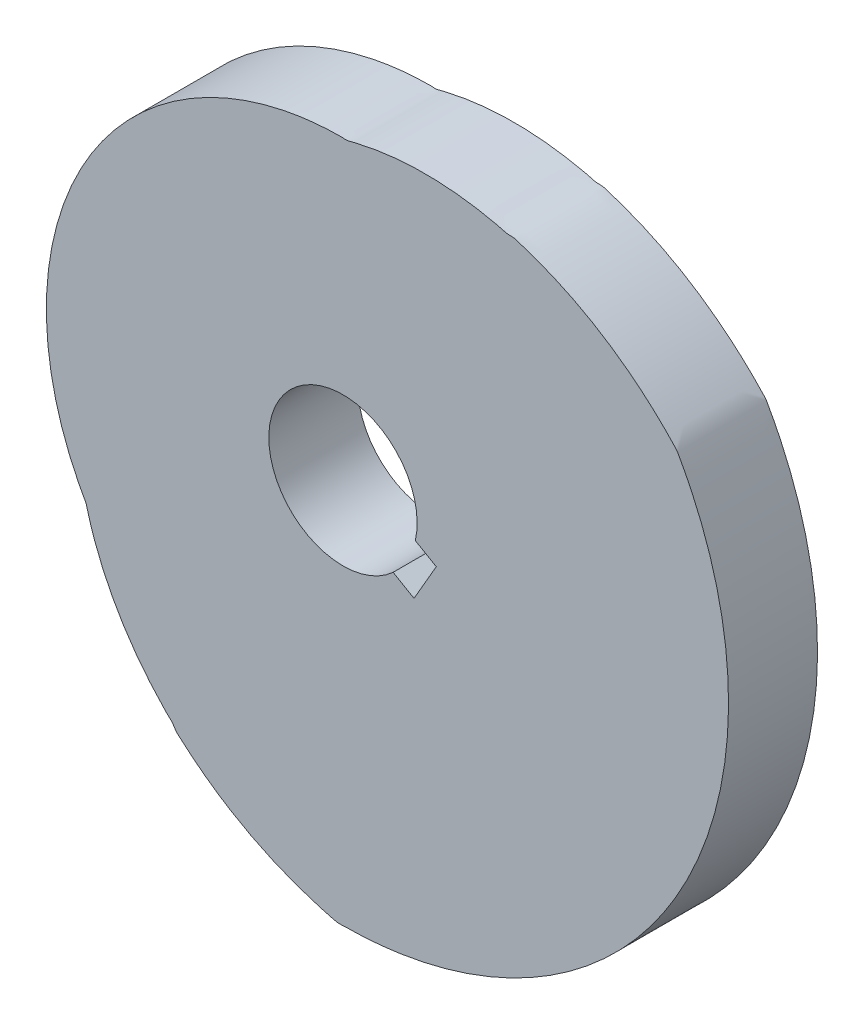
ISO-10303-21;
HEADER;
FILE_DESCRIPTION(('STEP AP214'),'2;1');
FILE_NAME('part.step','',(''),(''),'','','');
FILE_SCHEMA(('AUTOMOTIVE_DESIGN { 1 0 10303 214 1 1 1 1 }'));
ENDSEC;
DATA;
#1=APPLICATION_CONTEXT('core data for automotive mechanical design processes');
#2=APPLICATION_PROTOCOL_DEFINITION('international standard','automotive_design',2000,#1);
#3=PRODUCT_CONTEXT('',#1,'mechanical');
#4=PRODUCT('Part','Part','',(#3));
#5=PRODUCT_RELATED_PRODUCT_CATEGORY('part','',(#4));
#6=PRODUCT_DEFINITION_FORMATION('','',#4);
#7=PRODUCT_DEFINITION_CONTEXT('part definition',#1,'design');
#8=PRODUCT_DEFINITION('design','',#6,#7);
#9=PRODUCT_DEFINITION_SHAPE('','',#8);
#10=(LENGTH_UNIT() NAMED_UNIT(*) SI_UNIT(.MILLI.,.METRE.));
#11=(NAMED_UNIT(*) PLANE_ANGLE_UNIT() SI_UNIT($,.RADIAN.));
#12=(NAMED_UNIT(*) SI_UNIT($,.STERADIAN.) SOLID_ANGLE_UNIT());
#13=UNCERTAINTY_MEASURE_WITH_UNIT(LENGTH_MEASURE(1.E-05),#10,'distance_accuracy_value','');
#14=(GEOMETRIC_REPRESENTATION_CONTEXT(3) GLOBAL_UNCERTAINTY_ASSIGNED_CONTEXT((#13)) GLOBAL_UNIT_ASSIGNED_CONTEXT((#10,
#11,#12)) REPRESENTATION_CONTEXT('',''));
#15=CARTESIAN_POINT('',(0.,0.,0.));
#16=DIRECTION('',(0.,0.,1.));
#17=DIRECTION('',(1.,0.,0.));
#18=AXIS2_PLACEMENT_3D('',#15,#16,#17);
#19=CARTESIAN_POINT('',(-31.3220521803054,-28.7361578019046,12.));
#20=DIRECTION('',(0.,0.,1.));
#21=DIRECTION('',(1.,0.,0.));
#22=AXIS2_PLACEMENT_3D('',#19,#20,#21);
#23=PLANE('',#22);
#24=CARTESIAN_POINT('',(45.1375139420145,25.818691584479,12.));
#25=CARTESIAN_POINT('',(45.1146825222647,25.858606602012,12.));
#26=CARTESIAN_POINT('',(45.0689137924434,25.9383760677349,12.));
#27=CARTESIAN_POINT('',(44.9865616347543,26.051181125542,12.));
#28=CARTESIAN_POINT('',(44.9243310998781,26.1188960094875,12.));
#29=CARTESIAN_POINT('',(44.8931699539532,26.1527111737943,12.));
#30=CARTESIAN_POINT('',(44.5216769352879,26.5558445340137,12.));
#31=CARTESIAN_POINT('',(43.932009391613,27.1753236213259,12.));
#32=CARTESIAN_POINT('',(43.1104385471119,27.9956509431414,12.));
#33=CARTESIAN_POINT('',(42.4494659639389,28.6319249513327,12.));
#34=CARTESIAN_POINT('',(41.7794667058007,29.2536896581747,12.));
#35=CARTESIAN_POINT('',(41.1007453003057,29.8608246842116,12.));
#36=CARTESIAN_POINT('',(40.4136076813406,30.4532158450629,12.));
#37=CARTESIAN_POINT('',(39.7183611046927,31.0307551687494,12.));
#38=CARTESIAN_POINT('',(39.0153140142226,31.5933409054135,12.));
#39=CARTESIAN_POINT('',(38.3047759212348,32.1408775360101,12.));
#40=CARTESIAN_POINT('',(37.5870572804127,32.6732757782172,12.));
#41=CARTESIAN_POINT('',(36.8624693668106,33.190452590056,12.));
#42=CARTESIAN_POINT('',(36.1313241527549,33.6923311710322,12.));
#43=CARTESIAN_POINT('',(35.3939341850568,34.178840961101,12.));
#44=CARTESIAN_POINT('',(34.6506124623427,34.6499176364812,12.));
#45=CARTESIAN_POINT('',(33.9016723131523,35.1055031059402,12.));
#46=CARTESIAN_POINT('',(33.1474272726805,35.5455454941631,12.));
#47=CARTESIAN_POINT('',(32.3881909662416,35.9699991619211,12.));
#48=CARTESIAN_POINT('',(31.6242769696937,36.3788245786265,12.));
#49=CARTESIAN_POINT('',(30.8559987574643,36.7719887315482,12.));
#50=CARTESIAN_POINT('',(30.083669327889,37.1494635329817,12.));
#51=CARTESIAN_POINT('',(29.307602028269,37.5112316442159,12.));
#52=CARTESIAN_POINT('',(28.5281069317493,37.8572647725597,12.));
#53=CARTESIAN_POINT('',(27.7455037193961,38.1876040795103,12.));
#54=CARTESIAN_POINT('',(26.9600733343321,38.50206176566,12.));
#55=CARTESIAN_POINT('',(26.1722367779257,38.8013279743324,12.));
#56=CARTESIAN_POINT('',(25.3818912945507,39.0828644597575,12.));
#57=CARTESIAN_POINT('',(24.5908722728221,39.3561370240234,12.));
#58=CARTESIAN_POINT('',(23.793820402833,39.5861113830228,12.));
#59=CARTESIAN_POINT('',(22.9906355356767,39.9115269630809,12.));
#60=CARTESIAN_POINT('',(22.1216656693936,39.8140122974562,12.));
#61=CARTESIAN_POINT('',(21.3184028017399,40.1046608512462,12.));
#62=CARTESIAN_POINT('',(20.5213077995908,40.2712565739009,12.));
#63=CARTESIAN_POINT('',(19.7285046781832,40.4491337555346,12.));
#64=CARTESIAN_POINT('',(18.934815745728,40.6045148456853,12.));
#65=CARTESIAN_POINT('',(18.1419927236246,40.7464714026481,12.));
#66=CARTESIAN_POINT('',(17.3499395462985,40.8726722180211,12.));
#67=CARTESIAN_POINT('',(16.5590494027863,40.9838293214631,12.));
#68=CARTESIAN_POINT('',(15.7695823186814,41.0798513529012,12.));
#69=CARTESIAN_POINT('',(14.9818307548896,41.1608677106961,12.));
#70=CARTESIAN_POINT('',(14.1960753880527,41.2269557881758,12.));
#71=CARTESIAN_POINT('',(13.4125967582384,41.278213519306,12.));
#72=CARTESIAN_POINT('',(12.6316720437469,41.3147399833506,12.));
#73=CARTESIAN_POINT('',(11.853575797482,41.3366404863231,12.));
#74=CARTESIAN_POINT('',(11.0785796306525,41.3440251221162,12.));
#75=CARTESIAN_POINT('',(10.3069521779059,41.3370090727383,12.));
#76=CARTESIAN_POINT('',(9.53895899211167,41.3157124233372,12.));
#77=CARTESIAN_POINT('',(8.77486245005348,41.2802601786315,12.));
#78=CARTESIAN_POINT('',(8.01492169353169,41.230781947947,12.));
#79=CARTESIAN_POINT('',(7.25939242849471,41.1674127385473,12.));
#80=CARTESIAN_POINT('',(6.5085272630277,41.0902896626202,12.));
#81=CARTESIAN_POINT('',(5.76257405419242,40.9995637779329,12.));
#82=CARTESIAN_POINT('',(5.02178164458988,40.895355821003,12.));
#83=CARTESIAN_POINT('',(4.28637821303107,40.7779199243895,12.));
#84=CARTESIAN_POINT('',(3.55665115070893,40.6470363469999,12.));
#85=CARTESIAN_POINT('',(2.83265060948238,40.5042621033718,12.));
#86=CARTESIAN_POINT('',(2.11528799664478,40.3445881860127,12.));
#87=CARTESIAN_POINT('',(1.24782666705328,40.1533080354054,12.));
#88=CARTESIAN_POINT('',(0.631634374859922,39.9334378945776,12.));
#89=CARTESIAN_POINT('',(0.227217056019519,39.9642992261537,12.));
#90=CARTESIAN_POINT('',(0.176998450771492,39.9681314384641,12.));
#91=CARTESIAN_POINT('',(0.0769496216650999,39.9808853440723,12.));
#92=CARTESIAN_POINT('',(-0.0736132587577044,40.0000273863259,12.));
#93=CARTESIAN_POINT('',(-0.174341962512143,39.9996517669126,12.));
#94=CARTESIAN_POINT('',(-0.224705780026202,39.9993688364257,12.));
#95=CARTESIAN_POINT('',(-34.6069634558117,39.8062184879366,12.));
#96=CARTESIAN_POINT('',(-51.7854139904256,10.0223673741022,12.));
#97=CARTESIAN_POINT('',(-34.7355852354904,-19.8352998048423,12.));
#98=CARTESIAN_POINT('',(-34.7149304806663,-19.8714704200471,12.));
#99=CARTESIAN_POINT('',(-34.6735079762265,-19.9437471262647,12.));
#100=CARTESIAN_POINT('',(-34.6256423319763,-20.0616588265775,12.));
#101=CARTESIAN_POINT('',(-34.6052059445722,-20.1424183544329,12.));
#102=CARTESIAN_POINT('',(-34.5949226280262,-20.1827815270281,12.));
#103=CARTESIAN_POINT('',(-34.4903560652581,-20.5932170321298,12.));
#104=CARTESIAN_POINT('',(-34.3147089451669,-21.2382333641091,12.));
#105=CARTESIAN_POINT('',(-34.051889714492,-22.1140959330513,12.));
#106=CARTESIAN_POINT('',(-33.8265729604794,-22.8168594400827,12.));
#107=CARTESIAN_POINT('',(-33.5870484174464,-23.5184603864993,12.));
#108=CARTESIAN_POINT('',(-33.3332886427817,-24.2186160653096,12.));
#109=CARTESIAN_POINT('',(-33.0652717363569,-24.9170424421612,12.));
#110=CARTESIAN_POINT('',(-32.7829813944584,-25.6134542959464,12.));
#111=CARTESIAN_POINT('',(-32.4864069399912,-26.3075653189832,12.));
#112=CARTESIAN_POINT('',(-32.1755433564174,-26.9990882291884,12.));
#113=CARTESIAN_POINT('',(-31.8503913179985,-27.6877348800532,12.));
#114=CARTESIAN_POINT('',(-31.5109572183126,-28.3732163721897,12.));
#115=CARTESIAN_POINT('',(-31.1572531965328,-29.0552431654125,12.));
#116=CARTESIAN_POINT('',(-30.7892971614329,-29.7335251914549,12.));
#117=CARTESIAN_POINT('',(-30.4071128136735,-30.4077719677188,12.));
#118=CARTESIAN_POINT('',(-30.010729664087,-31.0776927101017,12.));
#119=CARTESIAN_POINT('',(-29.6001830564893,-31.7429964521127,12.));
#120=CARTESIAN_POINT('',(-29.1755141629144,-32.4033921429733,12.));
#121=CARTESIAN_POINT('',(-28.7367700718013,-33.0585888270609,12.));
#122=CARTESIAN_POINT('',(-28.2840035163402,-33.7082955200162,12.));
#123=CARTESIAN_POINT('',(-27.8172739436534,-34.3522222261925,12.));
#124=CARTESIAN_POINT('',(-27.3366435370521,-34.9900766710492,12.));
#125=CARTESIAN_POINT('',(-26.8421921830219,-35.6215771292271,12.));
#126=CARTESIAN_POINT('',(-26.3339612752131,-36.2464048022531,12.));
#127=CARTESIAN_POINT('',(-25.8121647729319,-36.8643832296415,12.));
#128=CARTESIAN_POINT('',(-25.2763965511123,-37.4748050572422,12.));
#129=CARTESIAN_POINT('',(-24.728607161581,-38.0789609018814,12.));
#130=CARTESIAN_POINT('',(-24.1619249230148,-38.670643052955,12.));
#131=CARTESIAN_POINT('',(-23.6026359714075,-39.2718074212572,12.));
#132=CARTESIAN_POINT('',(-22.9339019117336,-39.813761326399,12.));
#133=CARTESIAN_POINT('',(-22.5635942595921,-40.6129989424913,12.));
#134=CARTESIAN_POINT('',(-21.8649962663424,-41.1367752334924,12.));
#135=CARTESIAN_POINT('',(-21.2511595081493,-41.704835161853,12.));
#136=CARTESIAN_POINT('',(-20.603267988743,-42.2452201184356,12.));
#137=CARTESIAN_POINT('',(-19.94858417786,-42.7806873797805,12.));
#138=CARTESIAN_POINT('',(-19.2799443919699,-43.3047553718442,12.));
#139=CARTESIAN_POINT('',(-18.5994724785184,-43.8188271818331,12.));
#140=CARTESIAN_POINT('',(-17.9067959087357,-44.3221833459578,12.));
#141=CARTESIAN_POINT('',(-17.2022222434127,-44.8146795726867,12.));
#142=CARTESIAN_POINT('',(-16.4858828490174,-45.2960196987159,12.));
#143=CARTESIAN_POINT('',(-15.7579636621121,-45.7659518103205,12.));
#144=CARTESIAN_POINT('',(-15.0186429371753,-46.2242155249138,12.));
#145=CARTESIAN_POINT('',(-14.2681079723375,-46.6705563451511,12.));
#146=CARTESIAN_POINT('',(-13.5065505446389,-47.1047219333013,12.));
#147=CARTESIAN_POINT('',(-12.7341680810032,-47.5264632589804,12.));
#148=CARTESIAN_POINT('',(-11.9511632798901,-47.9355344280136,12.));
#149=CARTESIAN_POINT('',(-11.1577441496195,-48.3316928823991,12.));
#150=CARTESIAN_POINT('',(-10.3541239242068,-48.7146994367506,12.));
#151=CARTESIAN_POINT('',(-9.54052103695693,-49.084318592104,12.));
#152=CARTESIAN_POINT('',(-8.7171589721926,-49.4403178939774,12.));
#153=CARTESIAN_POINT('',(-7.88426653547609,-49.7824708491166,12.));
#154=CARTESIAN_POINT('',(-7.04207655034904,-50.1105464872198,12.));
#155=CARTESIAN_POINT('',(-6.19083044832525,-50.4243490405996,12.));
#156=CARTESIAN_POINT('',(-5.33076073085622,-50.7235695184947,12.));
#157=CARTESIAN_POINT('',(-4.46215646939338,-51.0083432516896,12.));
#158=CARTESIAN_POINT('',(-3.58511715243355,-51.2771579165623,12.));
#159=CARTESIAN_POINT('',(-2.7004761369747,-51.5347050394424,12.));
#160=CARTESIAN_POINT('',(-1.58532772918665,-51.8186985525633,12.));
#161=CARTESIAN_POINT('',(-0.769841320173459,-52.0746200739685,12.));
#162=CARTESIAN_POINT('',(-0.226209632260892,-52.0305720632972,12.));
#163=CARTESIAN_POINT('',(-0.176292161963245,-52.0265274770207,12.));
#164=CARTESIAN_POINT('',(-0.0767350828254432,-52.0150089942484,12.));
#165=CARTESIAN_POINT('',(0.0732065780635845,-52.000020818798,12.));
#166=CARTESIAN_POINT('',(0.173368394063963,-51.999735110022,12.));
#167=CARTESIAN_POINT('',(0.223448991171837,-51.9995199069024,12.));
#168=CARTESIAN_POINT('',(44.9867798212002,-51.8071658018382,12.));
#169=CARTESIAN_POINT('',(67.3633082390324,-13.0375415701507,12.));
#170=CARTESIAN_POINT('',(45.1375139420145,25.818691584479,12.));
#171=(BOUNDED_CURVE() B_SPLINE_CURVE(3,(#24,#25,#26,#27,#28,#29,#30,#31,#32,#33,#34,#35,#36,#37,
#38,#39,#40,#41,#42,#43,#44,#45,#46,#47,#48,#49,#50,#51,#52,#53,#54,#55,#56,#57,#58,#59,#60,#61,
#62,#63,#64,#65,#66,#67,#68,#69,#70,#71,#72,#73,#74,#75,#76,#77,#78,#79,#80,#81,#82,#83,#84,#85,
#86,#87,#88,#89,#90,#91,#92,#93,#94,#95,#96,#97,#98,#99,#100,#101,#102,#103,#104,#105,#106,#107,
#108,#109,#110,#111,#112,#113,#114,#115,#116,#117,#118,#119,#120,#121,#122,#123,#124,#125,#126,
#127,#128,#129,#130,#131,#132,#133,#134,#135,#136,#137,#138,#139,#140,#141,#142,#143,#144,#145,
#146,#147,#148,#149,#150,#151,#152,#153,#154,#155,#156,#157,#158,#159,#160,#161,#162,#163,#164,
#165,#166,#167,#168,#169,#170),.UNSPECIFIED.,.T.,.F.) B_SPLINE_CURVE_WITH_KNOTS((4,1,1,3,1,1,1,
1,1,1,1,1,1,1,1,1,1,1,1,1,1,1,1,1,1,1,1,1,1,1,1,1,1,1,1,1,1,1,1,1,1,1,1,1,1,1,1,1,1,1,1,1,1,1,1,
1,1,1,1,1,1,3,1,1,3,3,1,1,3,1,1,1,1,1,1,1,1,1,1,1,1,1,1,1,1,1,1,1,1,1,1,1,1,1,1,1,1,1,1,1,1,1,1,
1,1,1,1,1,1,1,1,1,1,1,1,1,1,1,1,1,1,1,1,1,1,1,3,1,1,3,4),(0.,0.000539854546905416,
0.00107970909381094,0.00161956364071636,0.00805553347807808,0.01165908907705,0.0152493116531498,
0.0188262036764522,0.0223897676447522,0.0259400060839757,0.0294769215485986,0.0330005166220726,
0.0365107939172595,0.0400077560768737,0.043491405773932,0.0469617457122131,0.0504187786267247,
0.0538625072841801,0.0572929344834824,0.0607100630562202,0.0641138958671706,0.0675044358148128,
0.0708816858318512,0.0742456488857486,0.07759632797927,0.0809337261510363,0.0842578464760895,
0.0875686920664674,0.0908662660717922,0.0941505716798675,0.0974216121172894,0.100679390650069,
0.103923910584265,0.107421904319601,0.110626668704688,0.113818188129065,0.116996466109011,
0.120161506204935,0.12331331202211,0.126451887211417,0.129577235470099,0.132689360542545,
0.135788266221073,0.138873956346742,0.141946434810177,0.145005705552405,0.148051772565722,
0.151084639894564,0.154104311636402,0.157110791942665,0.160104085019661,0.163084195129544,
0.166051126591277,0.169004883781637,0.171945471136222,0.174872893150498,0.177787154380855,
0.180688259445694,0.183576213026531,0.186451019869136,0.189312684784683,0.194020678935723,
0.194605295095236,0.195189911254749,0.195774527414262,0.463036609915361,0.463520098903989,
0.464003587892618,0.464487076881246,0.469403465621279,0.472245830199941,0.475101193155581,
0.477969559180411,0.480850932903117,0.483745318889981,0.486652721645973,0.489573145615829,
0.492506595185091,0.495453074681143,0.498412588374209,0.501385140478344,0.50437073515239,
0.507369376500923,0.510381068575177,0.513405815373947,0.516443620844472,0.519494488883309,
0.522558423337174,0.52563542800378,0.528725506632651,0.531828662925917,0.5349449005391,
0.53807422308188,0.541216634118844,0.544372137170222,0.547540735712613,0.550722433179683,
0.553917232962868,0.557399929571807,0.560634056239697,0.563881298380472,0.567141659184317,
0.57041514180306,0.573701749350781,0.577001484904397,0.580314351504248,0.583640352154666,
0.586979489824527,0.590331767447808,0.593697187924117,0.597075754119223,0.600467468865576,
0.603872334962808,0.607290355178237,0.610721532247355,0.614165868874304,0.61762336773235,
0.621094031464346,0.624577862683183,0.628074863972236,0.631585037885803,0.635108386949533,
0.638644913660845,0.642194620489348,0.64575750987724,0.649333584239715,0.655574566190206,
0.656147627029132,0.656720687868058,0.657293748706983,1.),
.UNSPECIFIED.) CURVE() GEOMETRIC_REPRESENTATION_ITEM() RATIONAL_B_SPLINE_CURVE((1.,1.,1.,1.,1.,
1.,1.,1.,1.,1.,1.,1.,1.,1.,1.,1.,1.,1.,1.,1.,1.,1.,1.,1.,1.,1.,1.,1.,1.,1.,1.,1.,1.,1.,1.,1.,1.,
1.,1.,1.,1.,1.,1.,1.,1.,1.,1.,1.,1.,1.,1.,1.,1.,1.,1.,1.,1.,1.,1.,1.,1.,1.,1.,1.,1.,1.,1.,1.,1.,
1.,1.,0.669654487287745,0.669654487287745,1.,1.,1.,1.,1.,1.,1.,1.,1.,1.,1.,1.,1.,1.,1.,1.,1.,1.,
1.,1.,1.,1.,1.,1.,1.,1.,1.,1.,1.,1.,1.,1.,1.,1.,1.,1.,1.,1.,1.,1.,1.,1.,1.,1.,1.,1.,1.,1.,1.,1.,
1.,1.,1.,1.,1.,1.,1.,1.,1.,1.,1.,1.,1.,1.,1.,1.,1.,1.,1.,1.,1.,0.669065133967935,
0.669065133967935,1.)) REPRESENTATION_ITEM(''));
#172=CARTESIAN_POINT('',(45.1375139420145,25.818691584479,12.));
#173=VERTEX_POINT('',#172);
#174=EDGE_CURVE('E119',#173,#173,#171,.T.);
#175=ORIENTED_EDGE('',*,*,#174,.T.);
#176=EDGE_LOOP('',(#175));
#177=FACE_BOUND('',#176,.T.);
#178=DIRECTION('',(0.866025403784439,-0.5,0.));
#179=VECTOR('',#178,1.);
#180=CARTESIAN_POINT('',(9.58512512714551,-8.99807618751146,12.));
#181=LINE('',#180,#179);
#182=CARTESIAN_POINT('',(6.76135582092916,-7.36777221843804,12.));
#183=VERTEX_POINT('',#182);
#184=CARTESIAN_POINT('',(9.58512512714551,-8.99807618751146,12.));
#185=VERTEX_POINT('',#184);
#186=EDGE_CURVE('E93',#183,#185,#181,.T.);
#187=ORIENTED_EDGE('',*,*,#186,.F.);
#188=CARTESIAN_POINT('',(0.,0.,12.));
#189=DIRECTION('',(0.,0.,1.));
#190=DIRECTION('',(1.,0.,0.));
#191=AXIS2_PLACEMENT_3D('',#188,#189,#190);
#192=CIRCLE('',#191,10.);
#193=CARTESIAN_POINT('',(9.76135582092916,-2.17161979573141,12.));
#194=VERTEX_POINT('',#193);
#195=EDGE_CURVE('E84',#194,#183,#192,.T.);
#196=ORIENTED_EDGE('',*,*,#195,.F.);
#197=DIRECTION('',(-0.866025403784439,0.5,0.));
#198=VECTOR('',#197,1.);
#199=CARTESIAN_POINT('',(9.76135582092916,-2.17161979573141,12.));
#200=LINE('',#199,#198);
#201=CARTESIAN_POINT('',(12.5851251271455,-3.80192376480482,12.));
#202=VERTEX_POINT('',#201);
#203=EDGE_CURVE('E109',#202,#194,#200,.T.);
#204=ORIENTED_EDGE('',*,*,#203,.F.);
#205=DIRECTION('',(0.5,0.866025403784439,0.));
#206=VECTOR('',#205,1.);
#207=CARTESIAN_POINT('',(12.5851251271455,-3.80192376480482,12.));
#208=LINE('',#207,#206);
#209=EDGE_CURVE('E105',#185,#202,#208,.T.);
#210=ORIENTED_EDGE('',*,*,#209,.F.);
#211=EDGE_LOOP('',(#187,#196,#204,#210));
#212=FACE_BOUND('',#211,.T.);
#213=ADVANCED_FACE('F43',(#177,#212),#23,.T.);
#214=CARTESIAN_POINT('',(-31.3220521803054,-28.7361578019046,0.));
#215=DIRECTION('',(0.,0.,1.));
#216=DIRECTION('',(1.,0.,0.));
#217=AXIS2_PLACEMENT_3D('',#214,#215,#216);
#218=PLANE('',#217);
#219=CARTESIAN_POINT('',(45.1375139420145,25.818691584479,0.));
#220=CARTESIAN_POINT('',(45.1146825222647,25.858606602012,0.));
#221=CARTESIAN_POINT('',(45.0689137924434,25.9383760677349,0.));
#222=CARTESIAN_POINT('',(44.9865616347543,26.051181125542,0.));
#223=CARTESIAN_POINT('',(44.9243310998781,26.1188960094875,0.));
#224=CARTESIAN_POINT('',(44.8931699539532,26.1527111737943,0.));
#225=CARTESIAN_POINT('',(44.5216769352879,26.5558445340137,0.));
#226=CARTESIAN_POINT('',(43.932009391613,27.1753236213259,0.));
#227=CARTESIAN_POINT('',(43.1104385471119,27.9956509431414,0.));
#228=CARTESIAN_POINT('',(42.4494659639389,28.6319249513327,0.));
#229=CARTESIAN_POINT('',(41.7794667058007,29.2536896581747,0.));
#230=CARTESIAN_POINT('',(41.1007453003057,29.8608246842116,0.));
#231=CARTESIAN_POINT('',(40.4136076813406,30.4532158450629,0.));
#232=CARTESIAN_POINT('',(39.7183611046927,31.0307551687494,0.));
#233=CARTESIAN_POINT('',(39.0153140142226,31.5933409054135,0.));
#234=CARTESIAN_POINT('',(38.3047759212348,32.1408775360101,0.));
#235=CARTESIAN_POINT('',(37.5870572804127,32.6732757782172,0.));
#236=CARTESIAN_POINT('',(36.8624693668106,33.190452590056,0.));
#237=CARTESIAN_POINT('',(36.1313241527549,33.6923311710322,0.));
#238=CARTESIAN_POINT('',(35.3939341850568,34.178840961101,0.));
#239=CARTESIAN_POINT('',(34.6506124623427,34.6499176364812,0.));
#240=CARTESIAN_POINT('',(33.9016723131523,35.1055031059402,0.));
#241=CARTESIAN_POINT('',(33.1474272726805,35.5455454941631,0.));
#242=CARTESIAN_POINT('',(32.3881909662416,35.9699991619211,0.));
#243=CARTESIAN_POINT('',(31.6242769696937,36.3788245786265,0.));
#244=CARTESIAN_POINT('',(30.8559987574643,36.7719887315482,0.));
#245=CARTESIAN_POINT('',(30.083669327889,37.1494635329817,0.));
#246=CARTESIAN_POINT('',(29.307602028269,37.5112316442159,0.));
#247=CARTESIAN_POINT('',(28.5281069317493,37.8572647725597,0.));
#248=CARTESIAN_POINT('',(27.7455037193961,38.1876040795103,0.));
#249=CARTESIAN_POINT('',(26.9600733343321,38.50206176566,0.));
#250=CARTESIAN_POINT('',(26.1722367779257,38.8013279743324,0.));
#251=CARTESIAN_POINT('',(25.3818912945507,39.0828644597575,0.));
#252=CARTESIAN_POINT('',(24.5908722728221,39.3561370240234,0.));
#253=CARTESIAN_POINT('',(23.793820402833,39.5861113830228,0.));
#254=CARTESIAN_POINT('',(22.9906355356767,39.9115269630809,0.));
#255=CARTESIAN_POINT('',(22.1216656693936,39.8140122974562,0.));
#256=CARTESIAN_POINT('',(21.3184028017399,40.1046608512462,0.));
#257=CARTESIAN_POINT('',(20.5213077995908,40.2712565739009,0.));
#258=CARTESIAN_POINT('',(19.7285046781832,40.4491337555346,0.));
#259=CARTESIAN_POINT('',(18.934815745728,40.6045148456853,0.));
#260=CARTESIAN_POINT('',(18.1419927236246,40.7464714026481,0.));
#261=CARTESIAN_POINT('',(17.3499395462985,40.8726722180211,0.));
#262=CARTESIAN_POINT('',(16.5590494027863,40.9838293214631,0.));
#263=CARTESIAN_POINT('',(15.7695823186814,41.0798513529012,0.));
#264=CARTESIAN_POINT('',(14.9818307548896,41.1608677106961,0.));
#265=CARTESIAN_POINT('',(14.1960753880527,41.2269557881758,0.));
#266=CARTESIAN_POINT('',(13.4125967582384,41.278213519306,0.));
#267=CARTESIAN_POINT('',(12.6316720437469,41.3147399833506,0.));
#268=CARTESIAN_POINT('',(11.853575797482,41.3366404863231,0.));
#269=CARTESIAN_POINT('',(11.0785796306525,41.3440251221162,0.));
#270=CARTESIAN_POINT('',(10.3069521779059,41.3370090727383,0.));
#271=CARTESIAN_POINT('',(9.53895899211167,41.3157124233372,0.));
#272=CARTESIAN_POINT('',(8.77486245005348,41.2802601786315,0.));
#273=CARTESIAN_POINT('',(8.01492169353169,41.230781947947,0.));
#274=CARTESIAN_POINT('',(7.25939242849471,41.1674127385473,0.));
#275=CARTESIAN_POINT('',(6.5085272630277,41.0902896626202,0.));
#276=CARTESIAN_POINT('',(5.76257405419242,40.9995637779329,0.));
#277=CARTESIAN_POINT('',(5.02178164458988,40.895355821003,0.));
#278=CARTESIAN_POINT('',(4.28637821303107,40.7779199243895,0.));
#279=CARTESIAN_POINT('',(3.55665115070893,40.6470363469999,0.));
#280=CARTESIAN_POINT('',(2.83265060948238,40.5042621033718,0.));
#281=CARTESIAN_POINT('',(2.11528799664478,40.3445881860127,0.));
#282=CARTESIAN_POINT('',(1.24782666705328,40.1533080354054,0.));
#283=CARTESIAN_POINT('',(0.631634374859922,39.9334378945776,0.));
#284=CARTESIAN_POINT('',(0.227217056019519,39.9642992261537,0.));
#285=CARTESIAN_POINT('',(0.176998450771492,39.9681314384641,0.));
#286=CARTESIAN_POINT('',(0.0769496216650999,39.9808853440723,0.));
#287=CARTESIAN_POINT('',(-0.0736132587577044,40.0000273863259,0.));
#288=CARTESIAN_POINT('',(-0.174341962512143,39.9996517669126,0.));
#289=CARTESIAN_POINT('',(-0.224705780026202,39.9993688364257,0.));
#290=CARTESIAN_POINT('',(-34.6069634558117,39.8062184879366,0.));
#291=CARTESIAN_POINT('',(-51.7854139904256,10.0223673741022,0.));
#292=CARTESIAN_POINT('',(-34.7355852354904,-19.8352998048423,0.));
#293=CARTESIAN_POINT('',(-34.7149304806663,-19.8714704200471,0.));
#294=CARTESIAN_POINT('',(-34.6735079762265,-19.9437471262647,0.));
#295=CARTESIAN_POINT('',(-34.6256423319763,-20.0616588265775,0.));
#296=CARTESIAN_POINT('',(-34.6052059445722,-20.1424183544329,0.));
#297=CARTESIAN_POINT('',(-34.5949226280262,-20.1827815270281,0.));
#298=CARTESIAN_POINT('',(-34.4903560652581,-20.5932170321298,0.));
#299=CARTESIAN_POINT('',(-34.3147089451669,-21.2382333641091,0.));
#300=CARTESIAN_POINT('',(-34.051889714492,-22.1140959330513,0.));
#301=CARTESIAN_POINT('',(-33.8265729604794,-22.8168594400827,0.));
#302=CARTESIAN_POINT('',(-33.5870484174464,-23.5184603864993,0.));
#303=CARTESIAN_POINT('',(-33.3332886427817,-24.2186160653096,0.));
#304=CARTESIAN_POINT('',(-33.0652717363569,-24.9170424421612,0.));
#305=CARTESIAN_POINT('',(-32.7829813944584,-25.6134542959464,0.));
#306=CARTESIAN_POINT('',(-32.4864069399912,-26.3075653189832,0.));
#307=CARTESIAN_POINT('',(-32.1755433564174,-26.9990882291884,0.));
#308=CARTESIAN_POINT('',(-31.8503913179985,-27.6877348800532,0.));
#309=CARTESIAN_POINT('',(-31.5109572183126,-28.3732163721897,0.));
#310=CARTESIAN_POINT('',(-31.1572531965328,-29.0552431654125,0.));
#311=CARTESIAN_POINT('',(-30.7892971614329,-29.7335251914549,0.));
#312=CARTESIAN_POINT('',(-30.4071128136735,-30.4077719677188,0.));
#313=CARTESIAN_POINT('',(-30.010729664087,-31.0776927101017,0.));
#314=CARTESIAN_POINT('',(-29.6001830564893,-31.7429964521127,0.));
#315=CARTESIAN_POINT('',(-29.1755141629144,-32.4033921429733,0.));
#316=CARTESIAN_POINT('',(-28.7367700718013,-33.0585888270609,0.));
#317=CARTESIAN_POINT('',(-28.2840035163402,-33.7082955200162,0.));
#318=CARTESIAN_POINT('',(-27.8172739436534,-34.3522222261925,0.));
#319=CARTESIAN_POINT('',(-27.3366435370521,-34.9900766710492,0.));
#320=CARTESIAN_POINT('',(-26.8421921830219,-35.6215771292271,0.));
#321=CARTESIAN_POINT('',(-26.3339612752131,-36.2464048022531,0.));
#322=CARTESIAN_POINT('',(-25.8121647729319,-36.8643832296415,0.));
#323=CARTESIAN_POINT('',(-25.2763965511123,-37.4748050572422,0.));
#324=CARTESIAN_POINT('',(-24.728607161581,-38.0789609018814,0.));
#325=CARTESIAN_POINT('',(-24.1619249230148,-38.670643052955,0.));
#326=CARTESIAN_POINT('',(-23.6026359714075,-39.2718074212572,0.));
#327=CARTESIAN_POINT('',(-22.9339019117336,-39.813761326399,0.));
#328=CARTESIAN_POINT('',(-22.5635942595921,-40.6129989424913,0.));
#329=CARTESIAN_POINT('',(-21.8649962663424,-41.1367752334924,0.));
#330=CARTESIAN_POINT('',(-21.2511595081493,-41.704835161853,0.));
#331=CARTESIAN_POINT('',(-20.603267988743,-42.2452201184356,0.));
#332=CARTESIAN_POINT('',(-19.94858417786,-42.7806873797805,0.));
#333=CARTESIAN_POINT('',(-19.2799443919699,-43.3047553718442,0.));
#334=CARTESIAN_POINT('',(-18.5994724785184,-43.8188271818331,0.));
#335=CARTESIAN_POINT('',(-17.9067959087357,-44.3221833459578,0.));
#336=CARTESIAN_POINT('',(-17.2022222434127,-44.8146795726867,0.));
#337=CARTESIAN_POINT('',(-16.4858828490174,-45.2960196987159,0.));
#338=CARTESIAN_POINT('',(-15.7579636621121,-45.7659518103205,0.));
#339=CARTESIAN_POINT('',(-15.0186429371753,-46.2242155249138,0.));
#340=CARTESIAN_POINT('',(-14.2681079723375,-46.6705563451511,0.));
#341=CARTESIAN_POINT('',(-13.5065505446389,-47.1047219333013,0.));
#342=CARTESIAN_POINT('',(-12.7341680810032,-47.5264632589804,0.));
#343=CARTESIAN_POINT('',(-11.9511632798901,-47.9355344280136,0.));
#344=CARTESIAN_POINT('',(-11.1577441496195,-48.3316928823991,0.));
#345=CARTESIAN_POINT('',(-10.3541239242068,-48.7146994367506,0.));
#346=CARTESIAN_POINT('',(-9.54052103695693,-49.084318592104,0.));
#347=CARTESIAN_POINT('',(-8.7171589721926,-49.4403178939774,0.));
#348=CARTESIAN_POINT('',(-7.88426653547609,-49.7824708491166,0.));
#349=CARTESIAN_POINT('',(-7.04207655034904,-50.1105464872198,0.));
#350=CARTESIAN_POINT('',(-6.19083044832525,-50.4243490405996,0.));
#351=CARTESIAN_POINT('',(-5.33076073085622,-50.7235695184947,0.));
#352=CARTESIAN_POINT('',(-4.46215646939338,-51.0083432516896,0.));
#353=CARTESIAN_POINT('',(-3.58511715243355,-51.2771579165623,0.));
#354=CARTESIAN_POINT('',(-2.7004761369747,-51.5347050394424,0.));
#355=CARTESIAN_POINT('',(-1.58532772918665,-51.8186985525633,0.));
#356=CARTESIAN_POINT('',(-0.769841320173459,-52.0746200739685,0.));
#357=CARTESIAN_POINT('',(-0.226209632260892,-52.0305720632972,0.));
#358=CARTESIAN_POINT('',(-0.176292161963245,-52.0265274770207,0.));
#359=CARTESIAN_POINT('',(-0.0767350828254432,-52.0150089942484,0.));
#360=CARTESIAN_POINT('',(0.0732065780635845,-52.000020818798,0.));
#361=CARTESIAN_POINT('',(0.173368394063963,-51.999735110022,0.));
#362=CARTESIAN_POINT('',(0.223448991171837,-51.9995199069024,0.));
#363=CARTESIAN_POINT('',(44.9867798212002,-51.8071658018382,0.));
#364=CARTESIAN_POINT('',(67.3633082390324,-13.0375415701507,0.));
#365=CARTESIAN_POINT('',(45.1375139420145,25.818691584479,0.));
#366=(BOUNDED_CURVE() B_SPLINE_CURVE(3,(#219,#220,#221,#222,#223,#224,#225,#226,#227,#228,#229,
#230,#231,#232,#233,#234,#235,#236,#237,#238,#239,#240,#241,#242,#243,#244,#245,#246,#247,#248,
#249,#250,#251,#252,#253,#254,#255,#256,#257,#258,#259,#260,#261,#262,#263,#264,#265,#266,#267,
#268,#269,#270,#271,#272,#273,#274,#275,#276,#277,#278,#279,#280,#281,#282,#283,#284,#285,#286,
#287,#288,#289,#290,#291,#292,#293,#294,#295,#296,#297,#298,#299,#300,#301,#302,#303,#304,#305,
#306,#307,#308,#309,#310,#311,#312,#313,#314,#315,#316,#317,#318,#319,#320,#321,#322,#323,#324,
#325,#326,#327,#328,#329,#330,#331,#332,#333,#334,#335,#336,#337,#338,#339,#340,#341,#342,#343,
#344,#345,#346,#347,#348,#349,#350,#351,#352,#353,#354,#355,#356,#357,#358,#359,#360,#361,#362,
#363,#364,#365),.UNSPECIFIED.,.T.,.F.) B_SPLINE_CURVE_WITH_KNOTS((4,1,1,3,1,1,1,1,1,1,1,1,1,1,1,
1,1,1,1,1,1,1,1,1,1,1,1,1,1,1,1,1,1,1,1,1,1,1,1,1,1,1,1,1,1,1,1,1,1,1,1,1,1,1,1,1,1,1,1,1,1,3,1,
1,3,3,1,1,3,1,1,1,1,1,1,1,1,1,1,1,1,1,1,1,1,1,1,1,1,1,1,1,1,1,1,1,1,1,1,1,1,1,1,1,1,1,1,1,1,1,1,
1,1,1,1,1,1,1,1,1,1,1,1,1,1,1,3,1,1,3,4),(0.,0.000539854546905416,0.00107970909381094,
0.00161956364071636,0.00805553347807808,0.01165908907705,0.0152493116531498,0.0188262036764522,
0.0223897676447522,0.0259400060839757,0.0294769215485986,0.0330005166220726,0.0365107939172595,
0.0400077560768737,0.043491405773932,0.0469617457122131,0.0504187786267247,0.0538625072841801,
0.0572929344834824,0.0607100630562202,0.0641138958671706,0.0675044358148128,0.0708816858318512,
0.0742456488857486,0.07759632797927,0.0809337261510363,0.0842578464760895,0.0875686920664674,
0.0908662660717922,0.0941505716798675,0.0974216121172894,0.100679390650069,0.103923910584265,
0.107421904319601,0.110626668704688,0.113818188129065,0.116996466109011,0.120161506204935,
0.12331331202211,0.126451887211417,0.129577235470099,0.132689360542545,0.135788266221073,
0.138873956346742,0.141946434810177,0.145005705552405,0.148051772565722,0.151084639894564,
0.154104311636402,0.157110791942665,0.160104085019661,0.163084195129544,0.166051126591277,
0.169004883781637,0.171945471136222,0.174872893150498,0.177787154380855,0.180688259445694,
0.183576213026531,0.186451019869136,0.189312684784683,0.194020678935723,0.194605295095236,
0.195189911254749,0.195774527414262,0.463036609915361,0.463520098903989,0.464003587892618,
0.464487076881246,0.469403465621279,0.472245830199941,0.475101193155581,0.477969559180411,
0.480850932903117,0.483745318889981,0.486652721645973,0.489573145615829,0.492506595185091,
0.495453074681143,0.498412588374209,0.501385140478344,0.50437073515239,0.507369376500923,
0.510381068575177,0.513405815373947,0.516443620844472,0.519494488883309,0.522558423337174,
0.52563542800378,0.528725506632651,0.531828662925917,0.5349449005391,0.53807422308188,
0.541216634118844,0.544372137170222,0.547540735712613,0.550722433179683,0.553917232962868,
0.557399929571807,0.560634056239697,0.563881298380472,0.567141659184317,0.57041514180306,
0.573701749350781,0.577001484904397,0.580314351504248,0.583640352154666,0.586979489824527,
0.590331767447808,0.593697187924117,0.597075754119223,0.600467468865576,0.603872334962808,
0.607290355178237,0.610721532247355,0.614165868874304,0.61762336773235,0.621094031464346,
0.624577862683183,0.628074863972236,0.631585037885803,0.635108386949533,0.638644913660845,
0.642194620489348,0.64575750987724,0.649333584239715,0.655574566190206,0.656147627029132,
0.656720687868058,0.657293748706983,1.),
.UNSPECIFIED.) CURVE() GEOMETRIC_REPRESENTATION_ITEM() RATIONAL_B_SPLINE_CURVE((1.,1.,1.,1.,1.,
1.,1.,1.,1.,1.,1.,1.,1.,1.,1.,1.,1.,1.,1.,1.,1.,1.,1.,1.,1.,1.,1.,1.,1.,1.,1.,1.,1.,1.,1.,1.,1.,
1.,1.,1.,1.,1.,1.,1.,1.,1.,1.,1.,1.,1.,1.,1.,1.,1.,1.,1.,1.,1.,1.,1.,1.,1.,1.,1.,1.,1.,1.,1.,1.,
1.,1.,0.669654487287745,0.669654487287745,1.,1.,1.,1.,1.,1.,1.,1.,1.,1.,1.,1.,1.,1.,1.,1.,1.,1.,
1.,1.,1.,1.,1.,1.,1.,1.,1.,1.,1.,1.,1.,1.,1.,1.,1.,1.,1.,1.,1.,1.,1.,1.,1.,1.,1.,1.,1.,1.,1.,1.,
1.,1.,1.,1.,1.,1.,1.,1.,1.,1.,1.,1.,1.,1.,1.,1.,1.,1.,1.,1.,1.,0.669065133967935,
0.669065133967935,1.)) REPRESENTATION_ITEM(''));
#367=CARTESIAN_POINT('',(45.1375139420145,25.818691584479,0.));
#368=VERTEX_POINT('',#367);
#369=EDGE_CURVE('E101',#368,#368,#366,.T.);
#370=ORIENTED_EDGE('',*,*,#369,.F.);
#371=EDGE_LOOP('',(#370));
#372=FACE_BOUND('',#371,.T.);
#373=CARTESIAN_POINT('',(0.,0.,0.));
#374=DIRECTION('',(0.,0.,1.));
#375=DIRECTION('',(1.,0.,0.));
#376=AXIS2_PLACEMENT_3D('',#373,#374,#375);
#377=CIRCLE('',#376,10.);
#378=CARTESIAN_POINT('',(6.76135582092916,-7.36777221843804,0.));
#379=VERTEX_POINT('',#378);
#380=CARTESIAN_POINT('',(9.76135582092915,-2.17161979573141,0.));
#381=VERTEX_POINT('',#380);
#382=EDGE_CURVE('E11',#379,#381,#377,.F.);
#383=ORIENTED_EDGE('',*,*,#382,.F.);
#384=DIRECTION('',(-0.866025403784439,0.5,0.));
#385=VECTOR('',#384,1.);
#386=CARTESIAN_POINT('',(-12.5484178034252,3.78073078157366,0.));
#387=LINE('',#386,#385);
#388=CARTESIAN_POINT('',(9.58512512714551,-8.99807618751146,0.));
#389=VERTEX_POINT('',#388);
#390=EDGE_CURVE('E53',#389,#379,#387,.T.);
#391=ORIENTED_EDGE('',*,*,#390,.F.);
#392=DIRECTION('',(-0.5,-0.866025403784439,0.));
#393=VECTOR('',#392,1.);
#394=CARTESIAN_POINT('',(-9.18850924973472,-41.5149647709897,0.));
#395=LINE('',#394,#393);
#396=CARTESIAN_POINT('',(12.5851251271455,-3.80192376480482,0.));
#397=VERTEX_POINT('',#396);
#398=EDGE_CURVE('E140',#397,#389,#395,.T.);
#399=ORIENTED_EDGE('',*,*,#398,.F.);
#400=DIRECTION('',(0.866025403784439,-0.5,0.));
#401=VECTOR('',#400,1.);
#402=CARTESIAN_POINT('',(-9.54841780342519,8.9768832042803,0.));
#403=LINE('',#402,#401);
#404=EDGE_CURVE('E126',#381,#397,#403,.T.);
#405=ORIENTED_EDGE('',*,*,#404,.F.);
#406=EDGE_LOOP('',(#383,#391,#399,#405));
#407=FACE_BOUND('',#406,.T.);
#408=ADVANCED_FACE('F148',(#372,#407),#218,.F.);
#409=DIRECTION('',(0.,0.,-1.));
#410=VECTOR('',#409,1.);
#411=SURFACE_OF_LINEAR_EXTRUSION('',#171,#410);
#412=ORIENTED_EDGE('',*,*,#174,.F.);
#413=EDGE_LOOP('',(#412));
#414=FACE_BOUND('',#413,.T.);
#415=ORIENTED_EDGE('',*,*,#369,.T.);
#416=EDGE_LOOP('',(#415));
#417=FACE_BOUND('',#416,.T.);
#418=ADVANCED_FACE('F45',(#414,#417),#411,.F.);
#419=CARTESIAN_POINT('',(0.,0.,12.));
#420=DIRECTION('',(0.,0.,-1.));
#421=DIRECTION('',(-1.,0.,0.));
#422=AXIS2_PLACEMENT_3D('',#419,#420,#421);
#423=CYLINDRICAL_SURFACE('',#422,10.);
#424=ORIENTED_EDGE('',*,*,#382,.T.);
#425=DIRECTION('',(0.,0.,-1.));
#426=VECTOR('',#425,1.);
#427=CARTESIAN_POINT('',(9.76135582092916,-2.17161979573141,12.));
#428=LINE('',#427,#426);
#429=EDGE_CURVE('E65',#194,#381,#428,.T.);
#430=ORIENTED_EDGE('',*,*,#429,.F.);
#431=ORIENTED_EDGE('',*,*,#195,.T.);
#432=DIRECTION('',(0.,0.,-1.));
#433=VECTOR('',#432,1.);
#434=CARTESIAN_POINT('',(6.76135582092916,-7.36777221843804,12.));
#435=LINE('',#434,#433);
#436=EDGE_CURVE('E87',#183,#379,#435,.T.);
#437=ORIENTED_EDGE('',*,*,#436,.T.);
#438=EDGE_LOOP('',(#424,#430,#431,#437));
#439=FACE_BOUND('',#438,.T.);
#440=ADVANCED_FACE('F86',(#439),#423,.F.);
#441=CARTESIAN_POINT('',(9.58512512714551,-8.99807618751146,12.));
#442=DIRECTION('',(0.5,0.866025403784439,0.));
#443=DIRECTION('',(-0.866025403784439,0.5,0.));
#444=AXIS2_PLACEMENT_3D('',#441,#442,#443);
#445=PLANE('',#444);
#446=ORIENTED_EDGE('',*,*,#390,.T.);
#447=ORIENTED_EDGE('',*,*,#436,.F.);
#448=ORIENTED_EDGE('',*,*,#186,.T.);
#449=DIRECTION('',(0.,0.,-1.));
#450=VECTOR('',#449,1.);
#451=CARTESIAN_POINT('',(9.58512512714551,-8.99807618751146,12.));
#452=LINE('',#451,#450);
#453=EDGE_CURVE('E102',#185,#389,#452,.T.);
#454=ORIENTED_EDGE('',*,*,#453,.T.);
#455=EDGE_LOOP('',(#446,#447,#448,#454));
#456=FACE_BOUND('',#455,.T.);
#457=ADVANCED_FACE('F96',(#456),#445,.T.);
#458=CARTESIAN_POINT('',(12.5851251271455,-3.80192376480482,12.));
#459=DIRECTION('',(-0.866025403784439,0.5,0.));
#460=DIRECTION('',(-0.5,-0.866025403784439,0.));
#461=AXIS2_PLACEMENT_3D('',#458,#459,#460);
#462=PLANE('',#461);
#463=ORIENTED_EDGE('',*,*,#398,.T.);
#464=ORIENTED_EDGE('',*,*,#453,.F.);
#465=ORIENTED_EDGE('',*,*,#209,.T.);
#466=DIRECTION('',(0.,0.,-1.));
#467=VECTOR('',#466,1.);
#468=CARTESIAN_POINT('',(12.5851251271455,-3.80192376480482,12.));
#469=LINE('',#468,#467);
#470=EDGE_CURVE('E60',#202,#397,#469,.T.);
#471=ORIENTED_EDGE('',*,*,#470,.T.);
#472=EDGE_LOOP('',(#463,#464,#465,#471));
#473=FACE_BOUND('',#472,.T.);
#474=ADVANCED_FACE('F145',(#473),#462,.T.);
#475=CARTESIAN_POINT('',(9.76135582092916,-2.17161979573141,12.));
#476=DIRECTION('',(-0.5,-0.866025403784439,0.));
#477=DIRECTION('',(0.866025403784439,-0.5,0.));
#478=AXIS2_PLACEMENT_3D('',#475,#476,#477);
#479=PLANE('',#478);
#480=ORIENTED_EDGE('',*,*,#404,.T.);
#481=ORIENTED_EDGE('',*,*,#470,.F.);
#482=ORIENTED_EDGE('',*,*,#203,.T.);
#483=ORIENTED_EDGE('',*,*,#429,.T.);
#484=EDGE_LOOP('',(#480,#481,#482,#483));
#485=FACE_BOUND('',#484,.T.);
#486=ADVANCED_FACE('F149',(#485),#479,.T.);
#487=CLOSED_SHELL('',(#213,#408,#418,#440,#457,#474,#486));
#488=MANIFOLD_SOLID_BREP('B2',#487);
#489=ADVANCED_BREP_SHAPE_REPRESENTATION('',(#18,#488),#14);
#490=SHAPE_DEFINITION_REPRESENTATION(#9,#489);
ENDSEC;
END-ISO-10303-21;
